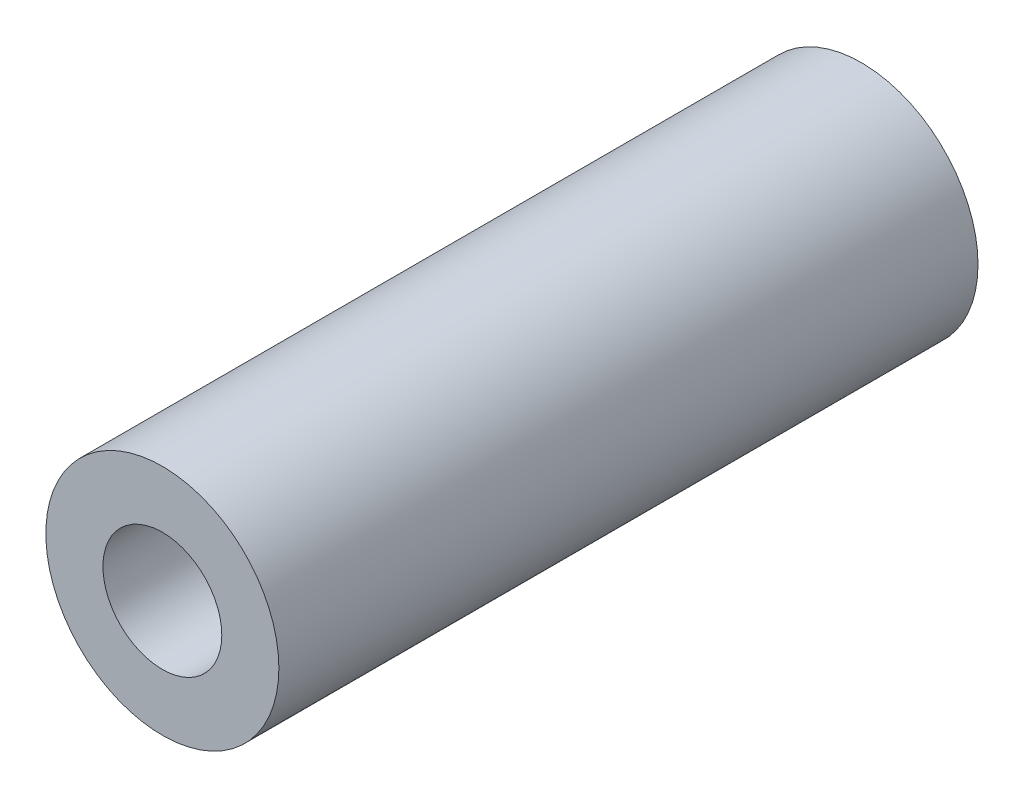
ISO-10303-21;
HEADER;
FILE_DESCRIPTION(('STEP AP214'),'2;1');
FILE_NAME('part.step','',(''),(''),'','','');
FILE_SCHEMA(('AUTOMOTIVE_DESIGN { 1 0 10303 214 1 1 1 1 }'));
ENDSEC;
DATA;
#1=APPLICATION_CONTEXT('core data for automotive mechanical design processes');
#2=APPLICATION_PROTOCOL_DEFINITION('international standard','automotive_design',2000,#1);
#3=PRODUCT_CONTEXT('',#1,'mechanical');
#4=PRODUCT('Part','Part','',(#3));
#5=PRODUCT_RELATED_PRODUCT_CATEGORY('part','',(#4));
#6=PRODUCT_DEFINITION_FORMATION('','',#4);
#7=PRODUCT_DEFINITION_CONTEXT('part definition',#1,'design');
#8=PRODUCT_DEFINITION('design','',#6,#7);
#9=PRODUCT_DEFINITION_SHAPE('','',#8);
#10=(LENGTH_UNIT() NAMED_UNIT(*) SI_UNIT(.MILLI.,.METRE.));
#11=(NAMED_UNIT(*) PLANE_ANGLE_UNIT() SI_UNIT($,.RADIAN.));
#12=(NAMED_UNIT(*) SI_UNIT($,.STERADIAN.) SOLID_ANGLE_UNIT());
#13=UNCERTAINTY_MEASURE_WITH_UNIT(LENGTH_MEASURE(1.E-05),#10,'distance_accuracy_value','');
#14=(GEOMETRIC_REPRESENTATION_CONTEXT(3) GLOBAL_UNCERTAINTY_ASSIGNED_CONTEXT((#13)) GLOBAL_UNIT_ASSIGNED_CONTEXT((#10,
#11,#12)) REPRESENTATION_CONTEXT('',''));
#15=CARTESIAN_POINT('',(0.,0.,0.));
#16=DIRECTION('',(0.,0.,1.));
#17=DIRECTION('',(1.,0.,0.));
#18=AXIS2_PLACEMENT_3D('',#15,#16,#17);
#19=CARTESIAN_POINT('',(0.,0.,29.1421356237309));
#20=DIRECTION('',(0.,0.,-1.));
#21=DIRECTION('',(-1.,0.,0.));
#22=AXIS2_PLACEMENT_3D('',#19,#20,#21);
#23=CYLINDRICAL_SURFACE('',#22,5.);
#24=CARTESIAN_POINT('',(0.,0.,-15.));
#25=DIRECTION('',(0.,0.,1.));
#26=DIRECTION('',(1.,0.,0.));
#27=AXIS2_PLACEMENT_3D('',#24,#25,#26);
#28=CIRCLE('',#27,5.);
#29=CARTESIAN_POINT('',(5.,0.,-15.));
#30=VERTEX_POINT('',#29);
#31=EDGE_CURVE('E37',#30,#30,#28,.T.);
#32=ORIENTED_EDGE('',*,*,#31,.T.);
#33=EDGE_LOOP('',(#32));
#34=FACE_BOUND('',#33,.T.);
#35=CARTESIAN_POINT('',(0.,0.,15.));
#36=DIRECTION('',(0.,0.,1.));
#37=DIRECTION('',(1.,0.,0.));
#38=AXIS2_PLACEMENT_3D('',#35,#36,#37);
#39=CIRCLE('',#38,5.);
#40=CARTESIAN_POINT('',(5.,0.,15.));
#41=VERTEX_POINT('',#40);
#42=EDGE_CURVE('E10',#41,#41,#39,.T.);
#43=ORIENTED_EDGE('',*,*,#42,.F.);
#44=EDGE_LOOP('',(#43));
#45=FACE_BOUND('',#44,.T.);
#46=ADVANCED_FACE('F30',(#34,#45),#23,.T.);
#47=CARTESIAN_POINT('',(0.,0.,-15.));
#48=DIRECTION('',(0.,0.,1.));
#49=DIRECTION('',(1.,0.,0.));
#50=AXIS2_PLACEMENT_3D('',#47,#48,#49);
#51=PLANE('',#50);
#52=CARTESIAN_POINT('',(0.,0.,-15.));
#53=DIRECTION('',(0.,0.,1.));
#54=DIRECTION('',(1.,0.,0.));
#55=AXIS2_PLACEMENT_3D('',#52,#53,#54);
#56=CIRCLE('',#55,2.55);
#57=CARTESIAN_POINT('',(2.55,0.,-15.));
#58=VERTEX_POINT('',#57);
#59=EDGE_CURVE('E41',#58,#58,#56,.T.);
#60=ORIENTED_EDGE('',*,*,#59,.T.);
#61=EDGE_LOOP('',(#60));
#62=FACE_BOUND('',#61,.T.);
#63=ORIENTED_EDGE('',*,*,#31,.F.);
#64=EDGE_LOOP('',(#63));
#65=FACE_BOUND('',#64,.T.);
#66=ADVANCED_FACE('F54',(#62,#65),#51,.F.);
#67=CARTESIAN_POINT('',(0.,0.,15.));
#68=DIRECTION('',(0.,0.,1.));
#69=DIRECTION('',(1.,0.,0.));
#70=AXIS2_PLACEMENT_3D('',#67,#68,#69);
#71=PLANE('',#70);
#72=CARTESIAN_POINT('',(0.,0.,15.));
#73=DIRECTION('',(0.,0.,1.));
#74=DIRECTION('',(1.,0.,0.));
#75=AXIS2_PLACEMENT_3D('',#72,#73,#74);
#76=CIRCLE('',#75,2.55);
#77=CARTESIAN_POINT('',(2.55,0.,15.));
#78=VERTEX_POINT('',#77);
#79=EDGE_CURVE('E45',#78,#78,#76,.T.);
#80=ORIENTED_EDGE('',*,*,#79,.F.);
#81=EDGE_LOOP('',(#80));
#82=FACE_BOUND('',#81,.T.);
#83=ORIENTED_EDGE('',*,*,#42,.T.);
#84=EDGE_LOOP('',(#83));
#85=FACE_BOUND('',#84,.T.);
#86=ADVANCED_FACE('F32',(#82,#85),#71,.T.);
#87=CARTESIAN_POINT('',(0.,0.,-15.));
#88=DIRECTION('',(0.,0.,1.));
#89=DIRECTION('',(1.,0.,0.));
#90=AXIS2_PLACEMENT_3D('',#87,#88,#89);
#91=CYLINDRICAL_SURFACE('',#90,2.55);
#92=ORIENTED_EDGE('',*,*,#59,.F.);
#93=EDGE_LOOP('',(#92));
#94=FACE_BOUND('',#93,.T.);
#95=ORIENTED_EDGE('',*,*,#79,.T.);
#96=EDGE_LOOP('',(#95));
#97=FACE_BOUND('',#96,.T.);
#98=ADVANCED_FACE('F51',(#94,#97),#91,.F.);
#99=CLOSED_SHELL('',(#46,#66,#86,#98));
#100=MANIFOLD_SOLID_BREP('B2',#99);
#101=ADVANCED_BREP_SHAPE_REPRESENTATION('',(#18,#100),#14);
#102=SHAPE_DEFINITION_REPRESENTATION(#9,#101);
ENDSEC;
END-ISO-10303-21;
